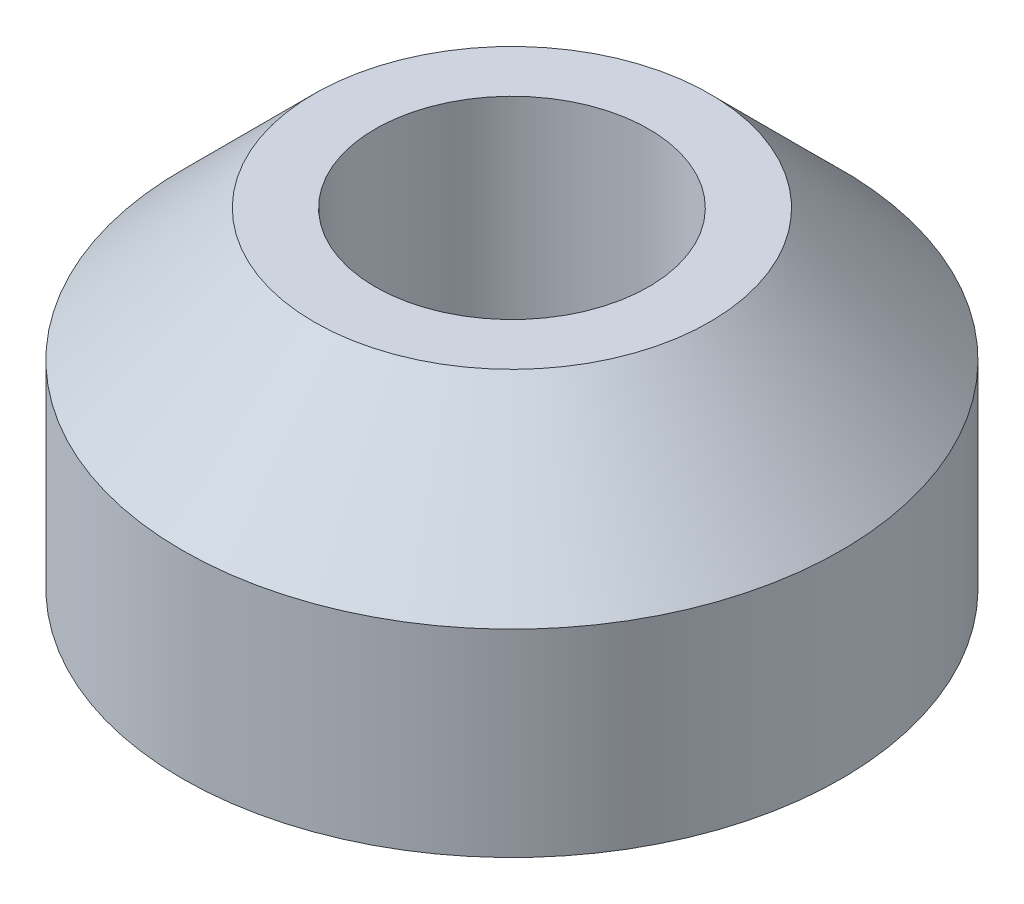
ISO-10303-21;
HEADER;
FILE_DESCRIPTION(('STEP AP214'),'2;1');
FILE_NAME('part.step','',(''),(''),'','','');
FILE_SCHEMA(('AUTOMOTIVE_DESIGN { 1 0 10303 214 1 1 1 1 }'));
ENDSEC;
DATA;
#1=APPLICATION_CONTEXT('core data for automotive mechanical design processes');
#2=APPLICATION_PROTOCOL_DEFINITION('international standard','automotive_design',2000,#1);
#3=PRODUCT_CONTEXT('',#1,'mechanical');
#4=PRODUCT('Part','Part','',(#3));
#5=PRODUCT_RELATED_PRODUCT_CATEGORY('part','',(#4));
#6=PRODUCT_DEFINITION_FORMATION('','',#4);
#7=PRODUCT_DEFINITION_CONTEXT('part definition',#1,'design');
#8=PRODUCT_DEFINITION('design','',#6,#7);
#9=PRODUCT_DEFINITION_SHAPE('','',#8);
#10=(LENGTH_UNIT() NAMED_UNIT(*) SI_UNIT(.MILLI.,.METRE.));
#11=(NAMED_UNIT(*) PLANE_ANGLE_UNIT() SI_UNIT($,.RADIAN.));
#12=(NAMED_UNIT(*) SI_UNIT($,.STERADIAN.) SOLID_ANGLE_UNIT());
#13=UNCERTAINTY_MEASURE_WITH_UNIT(LENGTH_MEASURE(1.E-05),#10,'distance_accuracy_value','');
#14=(GEOMETRIC_REPRESENTATION_CONTEXT(3) GLOBAL_UNCERTAINTY_ASSIGNED_CONTEXT((#13)) GLOBAL_UNIT_ASSIGNED_CONTEXT((#10,
#11,#12)) REPRESENTATION_CONTEXT('',''));
#15=CARTESIAN_POINT('',(0.,0.,0.));
#16=DIRECTION('',(0.,0.,1.));
#17=DIRECTION('',(1.,0.,0.));
#18=AXIS2_PLACEMENT_3D('',#15,#16,#17);
#19=CARTESIAN_POINT('',(0.,10.,0.));
#20=DIRECTION('',(0.,1.,0.));
#21=DIRECTION('',(0.,0.,1.));
#22=AXIS2_PLACEMENT_3D('',#19,#20,#21);
#23=PLANE('',#22);
#24=CARTESIAN_POINT('',(0.,10.,0.));
#25=DIRECTION('',(0.,1.,0.));
#26=DIRECTION('',(0.,0.,1.));
#27=AXIS2_PLACEMENT_3D('',#24,#25,#26);
#28=CIRCLE('',#27,6.);
#29=CARTESIAN_POINT('',(0.,10.,6.));
#30=VERTEX_POINT('',#29);
#31=EDGE_CURVE('E43',#30,#30,#28,.T.);
#32=ORIENTED_EDGE('',*,*,#31,.T.);
#33=EDGE_LOOP('',(#32));
#34=FACE_BOUND('',#33,.T.);
#35=CARTESIAN_POINT('',(0.,10.,0.));
#36=DIRECTION('',(0.,1.,0.));
#37=DIRECTION('',(0.,0.,1.));
#38=AXIS2_PLACEMENT_3D('',#35,#36,#37);
#39=CIRCLE('',#38,4.15);
#40=CARTESIAN_POINT('',(0.,10.,4.15));
#41=VERTEX_POINT('',#40);
#42=EDGE_CURVE('E51',#41,#41,#39,.T.);
#43=ORIENTED_EDGE('',*,*,#42,.F.);
#44=EDGE_LOOP('',(#43));
#45=FACE_BOUND('',#44,.T.);
#46=ADVANCED_FACE('F35',(#34,#45),#23,.T.);
#47=CARTESIAN_POINT('',(0.,0.,0.));
#48=DIRECTION('',(0.,1.,0.));
#49=DIRECTION('',(0.,0.,1.));
#50=AXIS2_PLACEMENT_3D('',#47,#48,#49);
#51=PLANE('',#50);
#52=CARTESIAN_POINT('',(0.,0.,0.));
#53=DIRECTION('',(0.,1.,0.));
#54=DIRECTION('',(0.,0.,1.));
#55=AXIS2_PLACEMENT_3D('',#52,#53,#54);
#56=CIRCLE('',#55,10.);
#57=CARTESIAN_POINT('',(0.,0.,10.));
#58=VERTEX_POINT('',#57);
#59=EDGE_CURVE('E47',#58,#58,#56,.T.);
#60=ORIENTED_EDGE('',*,*,#59,.F.);
#61=EDGE_LOOP('',(#60));
#62=FACE_BOUND('',#61,.T.);
#63=CARTESIAN_POINT('',(0.,0.,0.));
#64=DIRECTION('',(0.,1.,0.));
#65=DIRECTION('',(0.,0.,1.));
#66=AXIS2_PLACEMENT_3D('',#63,#64,#65);
#67=CIRCLE('',#66,4.15);
#68=CARTESIAN_POINT('',(0.,0.,4.15));
#69=VERTEX_POINT('',#68);
#70=EDGE_CURVE('E54',#69,#69,#67,.T.);
#71=ORIENTED_EDGE('',*,*,#70,.T.);
#72=EDGE_LOOP('',(#71));
#73=FACE_BOUND('',#72,.T.);
#74=ADVANCED_FACE('F64',(#62,#73),#51,.F.);
#75=CARTESIAN_POINT('',(0.,10.,0.));
#76=DIRECTION('',(0.,-1.,0.));
#77=DIRECTION('',(0.,0.,-1.));
#78=AXIS2_PLACEMENT_3D('',#75,#76,#77);
#79=CYLINDRICAL_SURFACE('',#78,10.);
#80=CARTESIAN_POINT('',(0.,5.99999999999999,0.));
#81=DIRECTION('',(0.,1.,0.));
#82=DIRECTION('',(0.,0.,1.));
#83=AXIS2_PLACEMENT_3D('',#80,#81,#82);
#84=CIRCLE('',#83,10.);
#85=CARTESIAN_POINT('',(0.,5.99999999999999,10.));
#86=VERTEX_POINT('',#85);
#87=EDGE_CURVE('E10',#86,#86,#84,.F.);
#88=ORIENTED_EDGE('',*,*,#87,.T.);
#89=EDGE_LOOP('',(#88));
#90=FACE_BOUND('',#89,.T.);
#91=ORIENTED_EDGE('',*,*,#59,.T.);
#92=EDGE_LOOP('',(#91));
#93=FACE_BOUND('',#92,.T.);
#94=ADVANCED_FACE('F69',(#90,#93),#79,.T.);
#95=CARTESIAN_POINT('',(0.,10.,0.));
#96=DIRECTION('',(0.,-1.,0.));
#97=DIRECTION('',(0.,0.,-1.));
#98=AXIS2_PLACEMENT_3D('',#95,#96,#97);
#99=CYLINDRICAL_SURFACE('',#98,4.15);
#100=ORIENTED_EDGE('',*,*,#42,.T.);
#101=EDGE_LOOP('',(#100));
#102=FACE_BOUND('',#101,.T.);
#103=ORIENTED_EDGE('',*,*,#70,.F.);
#104=EDGE_LOOP('',(#103));
#105=FACE_BOUND('',#104,.T.);
#106=ADVANCED_FACE('F60',(#102,#105),#99,.F.);
#107=CARTESIAN_POINT('',(0.,10.,0.));
#108=DIRECTION('',(0.,-1.,0.));
#109=DIRECTION('',(0.,0.,-1.));
#110=AXIS2_PLACEMENT_3D('',#107,#108,#109);
#111=CONICAL_SURFACE('',#110,6.,0.785398163397447);
#112=ORIENTED_EDGE('',*,*,#87,.F.);
#113=EDGE_LOOP('',(#112));
#114=FACE_BOUND('',#113,.T.);
#115=ORIENTED_EDGE('',*,*,#31,.F.);
#116=EDGE_LOOP('',(#115));
#117=FACE_BOUND('',#116,.T.);
#118=ADVANCED_FACE('F38',(#114,#117),#111,.T.);
#119=CLOSED_SHELL('',(#46,#74,#94,#106,#118));
#120=MANIFOLD_SOLID_BREP('B2',#119);
#121=ADVANCED_BREP_SHAPE_REPRESENTATION('',(#18,#120),#14);
#122=SHAPE_DEFINITION_REPRESENTATION(#9,#121);
ENDSEC;
END-ISO-10303-21;
